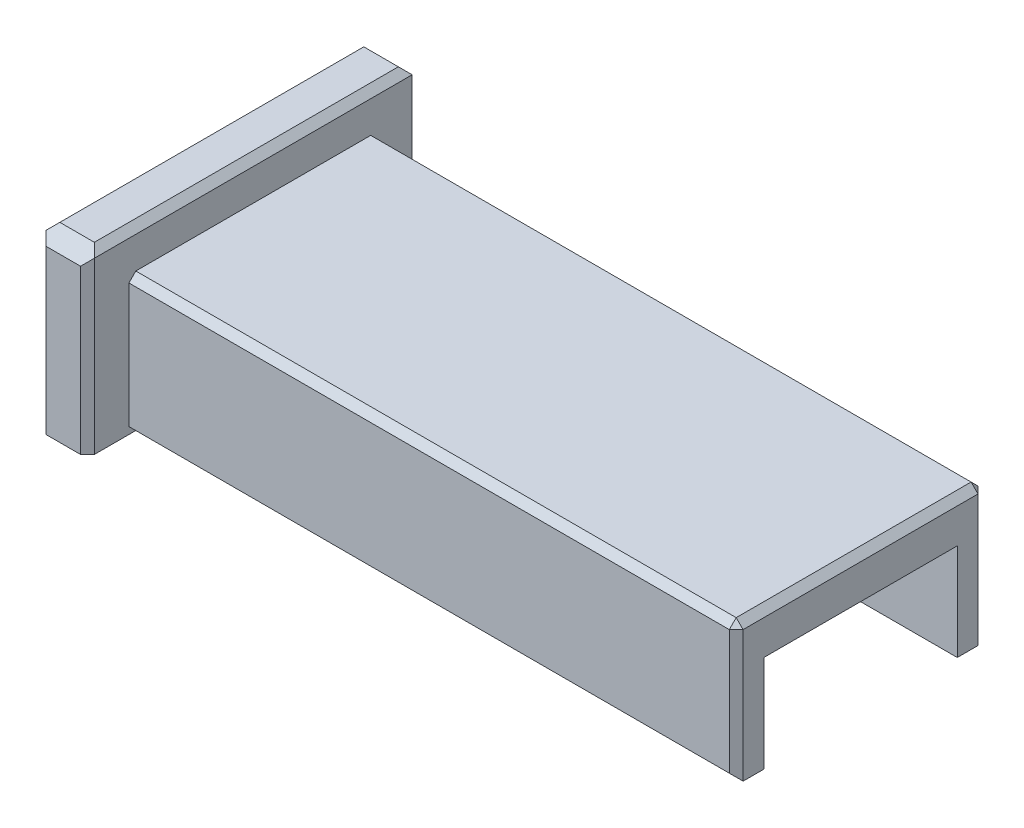
ISO-10303-21;
HEADER;
FILE_DESCRIPTION(('STEP AP214'),'2;1');
FILE_NAME('part.step','',(''),(''),'','','');
FILE_SCHEMA(('AUTOMOTIVE_DESIGN { 1 0 10303 214 1 1 1 1 }'));
ENDSEC;
DATA;
#1=APPLICATION_CONTEXT('core data for automotive mechanical design processes');
#2=APPLICATION_PROTOCOL_DEFINITION('international standard','automotive_design',2000,#1);
#3=PRODUCT_CONTEXT('',#1,'mechanical');
#4=PRODUCT('Part','Part','',(#3));
#5=PRODUCT_RELATED_PRODUCT_CATEGORY('part','',(#4));
#6=PRODUCT_DEFINITION_FORMATION('','',#4);
#7=PRODUCT_DEFINITION_CONTEXT('part definition',#1,'design');
#8=PRODUCT_DEFINITION('design','',#6,#7);
#9=PRODUCT_DEFINITION_SHAPE('','',#8);
#10=(LENGTH_UNIT() NAMED_UNIT(*) SI_UNIT(.MILLI.,.METRE.));
#11=(NAMED_UNIT(*) PLANE_ANGLE_UNIT() SI_UNIT($,.RADIAN.));
#12=(NAMED_UNIT(*) SI_UNIT($,.STERADIAN.) SOLID_ANGLE_UNIT());
#13=UNCERTAINTY_MEASURE_WITH_UNIT(LENGTH_MEASURE(1.E-05),#10,'distance_accuracy_value','');
#14=(GEOMETRIC_REPRESENTATION_CONTEXT(3) GLOBAL_UNCERTAINTY_ASSIGNED_CONTEXT((#13)) GLOBAL_UNIT_ASSIGNED_CONTEXT((#10,
#11,#12)) REPRESENTATION_CONTEXT('',''));
#15=CARTESIAN_POINT('',(0.,0.,0.));
#16=DIRECTION('',(0.,0.,1.));
#17=DIRECTION('',(1.,0.,0.));
#18=AXIS2_PLACEMENT_3D('',#15,#16,#17);
#19=CARTESIAN_POINT('',(0.,0.,0.));
#20=DIRECTION('',(0.,-1.,0.));
#21=DIRECTION('',(0.,0.,-1.));
#22=AXIS2_PLACEMENT_3D('',#19,#20,#21);
#23=PLANE('',#22);
#24=DIRECTION('',(0.,0.,1.));
#25=VECTOR('',#24,1.);
#26=CARTESIAN_POINT('',(-20.225,0.,-12.));
#27=LINE('',#26,#25);
#28=CARTESIAN_POINT('',(-20.225,0.,-11.5));
#29=VERTEX_POINT('',#28);
#30=CARTESIAN_POINT('',(-20.225,0.,-8.49999999999999));
#31=VERTEX_POINT('',#30);
#32=EDGE_CURVE('E408',#29,#31,#27,.T.);
#33=ORIENTED_EDGE('',*,*,#32,.T.);
#34=DIRECTION('',(1.,0.,0.));
#35=VECTOR('',#34,1.);
#36=CARTESIAN_POINT('',(23.725,0.,-8.49999999999999));
#37=LINE('',#36,#35);
#38=CARTESIAN_POINT('',(23.725,0.,-8.5));
#39=VERTEX_POINT('',#38);
#40=EDGE_CURVE('E230',#31,#39,#37,.T.);
#41=ORIENTED_EDGE('',*,*,#40,.T.);
#42=DIRECTION('',(0.,0.,-1.));
#43=VECTOR('',#42,1.);
#44=CARTESIAN_POINT('',(23.725,0.,9.));
#45=LINE('',#44,#43);
#46=CARTESIAN_POINT('',(23.725,0.,-7.));
#47=VERTEX_POINT('',#46);
#48=EDGE_CURVE('E223',#47,#39,#45,.T.);
#49=ORIENTED_EDGE('',*,*,#48,.F.);
#50=DIRECTION('',(-1.,0.,0.));
#51=VECTOR('',#50,1.);
#52=CARTESIAN_POINT('',(39.3774758424985,0.,-7.));
#53=LINE('',#52,#51);
#54=CARTESIAN_POINT('',(-23.225,0.,-7.));
#55=VERTEX_POINT('',#54);
#56=EDGE_CURVE('E207',#47,#55,#53,.T.);
#57=ORIENTED_EDGE('',*,*,#56,.T.);
#58=DIRECTION('',(0.70710678118654,0.,0.707106781186556));
#59=VECTOR('',#58,1.);
#60=CARTESIAN_POINT('',(-8.11250000000027,0.,8.11250000000009));
#61=LINE('',#60,#59);
#62=CARTESIAN_POINT('',(-23.725,0.,-7.5));
#63=VERTEX_POINT('',#62);
#64=EDGE_CURVE('E277',#55,#63,#61,.F.);
#65=ORIENTED_EDGE('',*,*,#64,.T.);
#66=DIRECTION('',(0.,0.,1.));
#67=VECTOR('',#66,1.);
#68=CARTESIAN_POINT('',(-23.725,0.,9.));
#69=LINE('',#68,#67);
#70=CARTESIAN_POINT('',(-23.725,0.,-11.5));
#71=VERTEX_POINT('',#70);
#72=EDGE_CURVE('E240',#71,#63,#69,.T.);
#73=ORIENTED_EDGE('',*,*,#72,.F.);
#74=DIRECTION('',(0.707106781186554,0.,-0.707106781186541));
#75=VECTOR('',#74,1.);
#76=CARTESIAN_POINT('',(-17.6124999999998,0.,-17.6125000000001));
#77=LINE('',#76,#75);
#78=CARTESIAN_POINT('',(-23.225,0.,-12.));
#79=VERTEX_POINT('',#78);
#80=EDGE_CURVE('E279',#71,#79,#77,.T.);
#81=ORIENTED_EDGE('',*,*,#80,.T.);
#82=DIRECTION('',(-1.,0.,0.));
#83=VECTOR('',#82,1.);
#84=CARTESIAN_POINT('',(-20.225,0.,-12.));
#85=LINE('',#84,#83);
#86=CARTESIAN_POINT('',(-20.725,0.,-12.));
#87=VERTEX_POINT('',#86);
#88=EDGE_CURVE('E402',#87,#79,#85,.T.);
#89=ORIENTED_EDGE('',*,*,#88,.F.);
#90=DIRECTION('',(-0.707106781186538,0.,-0.707106781186557));
#91=VECTOR('',#90,1.);
#92=CARTESIAN_POINT('',(-4.36250000000029,0.,4.36250000000017));
#93=LINE('',#92,#91);
#94=EDGE_CURVE('E281',#87,#29,#93,.F.);
#95=ORIENTED_EDGE('',*,*,#94,.T.);
#96=EDGE_LOOP('',(#33,#41,#49,#57,#65,#73,#81,#89,#95));
#97=FACE_BOUND('',#96,.T.);
#98=ADVANCED_FACE('F36',(#97),#23,.T.);
#99=CARTESIAN_POINT('',(23.725,10.,9.));
#100=DIRECTION('',(-1.,0.,0.));
#101=DIRECTION('',(0.,0.,1.));
#102=AXIS2_PLACEMENT_3D('',#99,#100,#101);
#103=PLANE('',#102);
#104=ORIENTED_EDGE('',*,*,#48,.T.);
#105=DIRECTION('',(0.,1.,0.));
#106=VECTOR('',#105,1.);
#107=CARTESIAN_POINT('',(23.725,10.,-8.5));
#108=LINE('',#107,#106);
#109=CARTESIAN_POINT('',(23.725,9.50000000000001,-8.5));
#110=VERTEX_POINT('',#109);
#111=EDGE_CURVE('E294',#39,#110,#108,.T.);
#112=ORIENTED_EDGE('',*,*,#111,.T.);
#113=DIRECTION('',(0.,0.,1.));
#114=VECTOR('',#113,1.);
#115=CARTESIAN_POINT('',(23.725,9.50000000000001,9.));
#116=LINE('',#115,#114);
#117=CARTESIAN_POINT('',(23.725,9.50000000000001,8.50000000000001));
#118=VERTEX_POINT('',#117);
#119=EDGE_CURVE('E292',#110,#118,#116,.T.);
#120=ORIENTED_EDGE('',*,*,#119,.T.);
#121=DIRECTION('',(0.,-1.,0.));
#122=VECTOR('',#121,1.);
#123=CARTESIAN_POINT('',(23.725,10.,8.50000000000001));
#124=LINE('',#123,#122);
#125=CARTESIAN_POINT('',(23.725,0.,8.50000000000001));
#126=VERTEX_POINT('',#125);
#127=EDGE_CURVE('E290',#118,#126,#124,.T.);
#128=ORIENTED_EDGE('',*,*,#127,.T.);
#129=CARTESIAN_POINT('',(23.725,0.,7.));
#130=VERTEX_POINT('',#129);
#131=EDGE_CURVE('E231',#126,#130,#45,.T.);
#132=ORIENTED_EDGE('',*,*,#131,.T.);
#133=DIRECTION('',(0.,-1.,0.));
#134=VECTOR('',#133,1.);
#135=CARTESIAN_POINT('',(23.725,0.,7.));
#136=LINE('',#135,#134);
#137=CARTESIAN_POINT('',(23.725,7.,7.));
#138=VERTEX_POINT('',#137);
#139=EDGE_CURVE('E517',#138,#130,#136,.T.);
#140=ORIENTED_EDGE('',*,*,#139,.F.);
#141=DIRECTION('',(0.,0.,1.));
#142=VECTOR('',#141,1.);
#143=CARTESIAN_POINT('',(23.725,7.,-7.));
#144=LINE('',#143,#142);
#145=CARTESIAN_POINT('',(23.725,7.,-7.));
#146=VERTEX_POINT('',#145);
#147=EDGE_CURVE('E226',#146,#138,#144,.T.);
#148=ORIENTED_EDGE('',*,*,#147,.F.);
#149=DIRECTION('',(0.,1.,0.));
#150=VECTOR('',#149,1.);
#151=CARTESIAN_POINT('',(23.725,0.,-7.));
#152=LINE('',#151,#150);
#153=EDGE_CURVE('E210',#47,#146,#152,.T.);
#154=ORIENTED_EDGE('',*,*,#153,.F.);
#155=EDGE_LOOP('',(#104,#112,#120,#128,#132,#140,#148,#154));
#156=FACE_BOUND('',#155,.T.);
#157=ADVANCED_FACE('F222',(#156),#103,.F.);
#158=CARTESIAN_POINT('',(-23.725,10.,-9.));
#159=DIRECTION('',(0.,0.,1.));
#160=DIRECTION('',(1.,0.,0.));
#161=AXIS2_PLACEMENT_3D('',#158,#159,#160);
#162=PLANE('',#161);
#163=DIRECTION('',(0.,-1.,0.));
#164=VECTOR('',#163,1.);
#165=CARTESIAN_POINT('',(23.225,10.,-9.));
#166=LINE('',#165,#164);
#167=CARTESIAN_POINT('',(23.225,9.5,-9.));
#168=VERTEX_POINT('',#167);
#169=CARTESIAN_POINT('',(23.225,0.499999999999994,-9.));
#170=VERTEX_POINT('',#169);
#171=EDGE_CURVE('E271',#168,#170,#166,.T.);
#172=ORIENTED_EDGE('',*,*,#171,.T.);
#173=DIRECTION('',(-1.,0.,0.));
#174=VECTOR('',#173,1.);
#175=CARTESIAN_POINT('',(-20.225,0.499999999999994,-9.));
#176=LINE('',#175,#174);
#177=CARTESIAN_POINT('',(-20.225,0.499999999999994,-9.));
#178=VERTEX_POINT('',#177);
#179=EDGE_CURVE('E275',#170,#178,#176,.T.);
#180=ORIENTED_EDGE('',*,*,#179,.T.);
#181=DIRECTION('',(0.,1.,0.));
#182=VECTOR('',#181,1.);
#183=CARTESIAN_POINT('',(-20.225,10.,-9.));
#184=LINE('',#183,#182);
#185=CARTESIAN_POINT('',(-20.225,9.5,-9.));
#186=VERTEX_POINT('',#185);
#187=EDGE_CURVE('E232',#178,#186,#184,.T.);
#188=ORIENTED_EDGE('',*,*,#187,.T.);
#189=DIRECTION('',(1.,0.,0.));
#190=VECTOR('',#189,1.);
#191=CARTESIAN_POINT('',(-23.725,9.5,-9.));
#192=LINE('',#191,#190);
#193=EDGE_CURVE('E273',#186,#168,#192,.T.);
#194=ORIENTED_EDGE('',*,*,#193,.T.);
#195=EDGE_LOOP('',(#172,#180,#188,#194));
#196=FACE_BOUND('',#195,.T.);
#197=ADVANCED_FACE('F464',(#196),#162,.F.);
#198=CARTESIAN_POINT('',(-23.725,10.,9.));
#199=DIRECTION('',(1.,0.,0.));
#200=DIRECTION('',(0.,0.,-1.));
#201=AXIS2_PLACEMENT_3D('',#198,#199,#200);
#202=PLANE('',#201);
#203=DIRECTION('',(0.,0.,-1.));
#204=VECTOR('',#203,1.);
#205=CARTESIAN_POINT('',(-23.725,12.3,-11.));
#206=LINE('',#205,#204);
#207=CARTESIAN_POINT('',(-23.725,12.3,11.5));
#208=VERTEX_POINT('',#207);
#209=CARTESIAN_POINT('',(-23.725,12.3,-11.5));
#210=VERTEX_POINT('',#209);
#211=EDGE_CURVE('E346',#208,#210,#206,.T.);
#212=ORIENTED_EDGE('',*,*,#211,.T.);
#213=DIRECTION('',(0.,-1.,0.));
#214=VECTOR('',#213,1.);
#215=CARTESIAN_POINT('',(-23.725,0.,-11.5));
#216=LINE('',#215,#214);
#217=EDGE_CURVE('E349',#210,#71,#216,.T.);
#218=ORIENTED_EDGE('',*,*,#217,.T.);
#219=ORIENTED_EDGE('',*,*,#72,.T.);
#220=DIRECTION('',(0.,1.,0.));
#221=VECTOR('',#220,1.);
#222=CARTESIAN_POINT('',(-23.725,10.,-7.5));
#223=LINE('',#222,#221);
#224=CARTESIAN_POINT('',(-23.725,7.5,-7.5));
#225=VERTEX_POINT('',#224);
#226=EDGE_CURVE('E337',#63,#225,#223,.T.);
#227=ORIENTED_EDGE('',*,*,#226,.T.);
#228=DIRECTION('',(0.,0.,1.));
#229=VECTOR('',#228,1.);
#230=CARTESIAN_POINT('',(-23.725,7.5,9.));
#231=LINE('',#230,#229);
#232=CARTESIAN_POINT('',(-23.725,7.5,7.5));
#233=VERTEX_POINT('',#232);
#234=EDGE_CURVE('E339',#225,#233,#231,.T.);
#235=ORIENTED_EDGE('',*,*,#234,.T.);
#236=DIRECTION('',(0.,-1.,0.));
#237=VECTOR('',#236,1.);
#238=CARTESIAN_POINT('',(-23.725,10.,7.5));
#239=LINE('',#238,#237);
#240=CARTESIAN_POINT('',(-23.725,0.,7.5));
#241=VERTEX_POINT('',#240);
#242=EDGE_CURVE('E341',#233,#241,#239,.T.);
#243=ORIENTED_EDGE('',*,*,#242,.T.);
#244=CARTESIAN_POINT('',(-23.725,0.,11.5));
#245=VERTEX_POINT('',#244);
#246=EDGE_CURVE('E234',#241,#245,#69,.T.);
#247=ORIENTED_EDGE('',*,*,#246,.T.);
#248=DIRECTION('',(0.,1.,0.));
#249=VECTOR('',#248,1.);
#250=CARTESIAN_POINT('',(-23.725,11.8,11.5));
#251=LINE('',#250,#249);
#252=EDGE_CURVE('E343',#245,#208,#251,.T.);
#253=ORIENTED_EDGE('',*,*,#252,.T.);
#254=EDGE_LOOP('',(#212,#218,#219,#227,#235,#243,#247,#253));
#255=FACE_BOUND('',#254,.T.);
#256=ADVANCED_FACE('F393',(#255),#202,.F.);
#257=CARTESIAN_POINT('',(-23.725,10.,9.));
#258=DIRECTION('',(0.,0.,-1.));
#259=DIRECTION('',(-1.,0.,0.));
#260=AXIS2_PLACEMENT_3D('',#257,#258,#259);
#261=PLANE('',#260);
#262=DIRECTION('',(0.,-1.,0.));
#263=VECTOR('',#262,1.);
#264=CARTESIAN_POINT('',(-20.225,10.,9.));
#265=LINE('',#264,#263);
#266=CARTESIAN_POINT('',(-20.225,9.5,9.));
#267=VERTEX_POINT('',#266);
#268=CARTESIAN_POINT('',(-20.225,0.5,9.));
#269=VERTEX_POINT('',#268);
#270=EDGE_CURVE('E236',#267,#269,#265,.T.);
#271=ORIENTED_EDGE('',*,*,#270,.T.);
#272=DIRECTION('',(1.,0.,0.));
#273=VECTOR('',#272,1.);
#274=CARTESIAN_POINT('',(23.725,0.5,9.));
#275=LINE('',#274,#273);
#276=CARTESIAN_POINT('',(23.225,0.5,9.));
#277=VERTEX_POINT('',#276);
#278=EDGE_CURVE('E259',#269,#277,#275,.T.);
#279=ORIENTED_EDGE('',*,*,#278,.T.);
#280=DIRECTION('',(0.,1.,0.));
#281=VECTOR('',#280,1.);
#282=CARTESIAN_POINT('',(23.225,10.,9.));
#283=LINE('',#282,#281);
#284=CARTESIAN_POINT('',(23.225,9.5,9.));
#285=VERTEX_POINT('',#284);
#286=EDGE_CURVE('E255',#277,#285,#283,.T.);
#287=ORIENTED_EDGE('',*,*,#286,.T.);
#288=DIRECTION('',(-1.,0.,0.));
#289=VECTOR('',#288,1.);
#290=CARTESIAN_POINT('',(-23.725,9.5,9.));
#291=LINE('',#290,#289);
#292=EDGE_CURVE('E257',#285,#267,#291,.T.);
#293=ORIENTED_EDGE('',*,*,#292,.T.);
#294=EDGE_LOOP('',(#271,#279,#287,#293));
#295=FACE_BOUND('',#294,.T.);
#296=ADVANCED_FACE('F420',(#295),#261,.F.);
#297=CARTESIAN_POINT('',(0.,10.,0.));
#298=DIRECTION('',(0.,-1.,0.));
#299=DIRECTION('',(0.,0.,-1.));
#300=AXIS2_PLACEMENT_3D('',#297,#298,#299);
#301=PLANE('',#300);
#302=DIRECTION('',(0.,0.,-1.));
#303=VECTOR('',#302,1.);
#304=CARTESIAN_POINT('',(23.225,10.,0.));
#305=LINE('',#304,#303);
#306=CARTESIAN_POINT('',(23.225,10.,8.50000000000001));
#307=VERTEX_POINT('',#306);
#308=CARTESIAN_POINT('',(23.225,10.,-8.5));
#309=VERTEX_POINT('',#308);
#310=EDGE_CURVE('E284',#307,#309,#305,.T.);
#311=ORIENTED_EDGE('',*,*,#310,.T.);
#312=DIRECTION('',(-1.,0.,0.));
#313=VECTOR('',#312,1.);
#314=CARTESIAN_POINT('',(0.,10.,-8.5));
#315=LINE('',#314,#313);
#316=CARTESIAN_POINT('',(-20.225,10.,-8.5));
#317=VERTEX_POINT('',#316);
#318=EDGE_CURVE('E288',#309,#317,#315,.T.);
#319=ORIENTED_EDGE('',*,*,#318,.T.);
#320=DIRECTION('',(0.,0.,1.));
#321=VECTOR('',#320,1.);
#322=CARTESIAN_POINT('',(-20.225,10.,0.));
#323=LINE('',#322,#321);
#324=CARTESIAN_POINT('',(-20.225,10.,8.50000000000001));
#325=VERTEX_POINT('',#324);
#326=EDGE_CURVE('E411',#317,#325,#323,.T.);
#327=ORIENTED_EDGE('',*,*,#326,.T.);
#328=DIRECTION('',(1.,0.,0.));
#329=VECTOR('',#328,1.);
#330=CARTESIAN_POINT('',(0.,10.,8.50000000000001));
#331=LINE('',#330,#329);
#332=EDGE_CURVE('E286',#325,#307,#331,.T.);
#333=ORIENTED_EDGE('',*,*,#332,.T.);
#334=EDGE_LOOP('',(#311,#319,#327,#333));
#335=FACE_BOUND('',#334,.T.);
#336=ADVANCED_FACE('F448',(#335),#301,.F.);
#337=ORIENTED_EDGE('',*,*,#131,.F.);
#338=DIRECTION('',(-1.,0.,0.));
#339=VECTOR('',#338,1.);
#340=CARTESIAN_POINT('',(-20.225,0.,8.50000000000001));
#341=LINE('',#340,#339);
#342=CARTESIAN_POINT('',(-20.225,0.,8.50000000000001));
#343=VERTEX_POINT('',#342);
#344=EDGE_CURVE('E268',#126,#343,#341,.T.);
#345=ORIENTED_EDGE('',*,*,#344,.T.);
#346=CARTESIAN_POINT('',(-20.225,0.,11.5));
#347=VERTEX_POINT('',#346);
#348=EDGE_CURVE('E227',#343,#347,#27,.T.);
#349=ORIENTED_EDGE('',*,*,#348,.T.);
#350=DIRECTION('',(0.707106781186538,0.,-0.707106781186557));
#351=VECTOR('',#350,1.);
#352=CARTESIAN_POINT('',(-4.36250000000029,0.,-4.36250000000017));
#353=LINE('',#352,#351);
#354=CARTESIAN_POINT('',(-20.725,0.,12.));
#355=VERTEX_POINT('',#354);
#356=EDGE_CURVE('E266',#347,#355,#353,.F.);
#357=ORIENTED_EDGE('',*,*,#356,.T.);
#358=DIRECTION('',(-1.,0.,0.));
#359=VECTOR('',#358,1.);
#360=CARTESIAN_POINT('',(-20.225,0.,12.));
#361=LINE('',#360,#359);
#362=CARTESIAN_POINT('',(-23.225,0.,12.));
#363=VERTEX_POINT('',#362);
#364=EDGE_CURVE('E407',#355,#363,#361,.T.);
#365=ORIENTED_EDGE('',*,*,#364,.T.);
#366=DIRECTION('',(-0.707106781186552,0.,-0.707106781186543));
#367=VECTOR('',#366,1.);
#368=CARTESIAN_POINT('',(-17.6124999999998,0.,17.6125000000001));
#369=LINE('',#368,#367);
#370=EDGE_CURVE('E264',#363,#245,#369,.T.);
#371=ORIENTED_EDGE('',*,*,#370,.T.);
#372=ORIENTED_EDGE('',*,*,#246,.F.);
#373=DIRECTION('',(-0.70710678118654,0.,0.707106781186555));
#374=VECTOR('',#373,1.);
#375=CARTESIAN_POINT('',(-8.11250000000025,0.,-8.11250000000008));
#376=LINE('',#375,#374);
#377=CARTESIAN_POINT('',(-23.225,0.,7.));
#378=VERTEX_POINT('',#377);
#379=EDGE_CURVE('E262',#241,#378,#376,.F.);
#380=ORIENTED_EDGE('',*,*,#379,.T.);
#381=DIRECTION('',(-1.,0.,0.));
#382=VECTOR('',#381,1.);
#383=CARTESIAN_POINT('',(39.3774758424985,0.,7.));
#384=LINE('',#383,#382);
#385=EDGE_CURVE('E216',#130,#378,#384,.T.);
#386=ORIENTED_EDGE('',*,*,#385,.F.);
#387=EDGE_LOOP('',(#337,#345,#349,#357,#365,#371,#372,#380,#386));
#388=FACE_BOUND('',#387,.T.);
#389=ADVANCED_FACE('F487',(#388),#23,.T.);
#390=CARTESIAN_POINT('',(-20.225,0.,0.));
#391=DIRECTION('',(1.,0.,0.));
#392=DIRECTION('',(0.,0.,-1.));
#393=AXIS2_PLACEMENT_3D('',#390,#391,#392);
#394=PLANE('',#393);
#395=ORIENTED_EDGE('',*,*,#32,.F.);
#396=DIRECTION('',(0.,1.,0.));
#397=VECTOR('',#396,1.);
#398=CARTESIAN_POINT('',(-20.225,0.,-11.5));
#399=LINE('',#398,#397);
#400=CARTESIAN_POINT('',(-20.225,12.3,-11.5));
#401=VERTEX_POINT('',#400);
#402=EDGE_CURVE('E306',#29,#401,#399,.T.);
#403=ORIENTED_EDGE('',*,*,#402,.T.);
#404=DIRECTION('',(0.,0.,1.));
#405=VECTOR('',#404,1.);
#406=CARTESIAN_POINT('',(-20.225,12.3,0.));
#407=LINE('',#406,#405);
#408=CARTESIAN_POINT('',(-20.225,12.3,11.5));
#409=VERTEX_POINT('',#408);
#410=EDGE_CURVE('E303',#401,#409,#407,.T.);
#411=ORIENTED_EDGE('',*,*,#410,.T.);
#412=DIRECTION('',(0.,-1.,0.));
#413=VECTOR('',#412,1.);
#414=CARTESIAN_POINT('',(-20.225,0.,11.5));
#415=LINE('',#414,#413);
#416=EDGE_CURVE('E301',#409,#347,#415,.T.);
#417=ORIENTED_EDGE('',*,*,#416,.T.);
#418=ORIENTED_EDGE('',*,*,#348,.F.);
#419=DIRECTION('',(0.,0.707106781186552,0.707106781186543));
#420=VECTOR('',#419,1.);
#421=CARTESIAN_POINT('',(-20.225,0.5,9.));
#422=LINE('',#421,#420);
#423=EDGE_CURVE('E357',#343,#269,#422,.T.);
#424=ORIENTED_EDGE('',*,*,#423,.T.);
#425=ORIENTED_EDGE('',*,*,#270,.F.);
#426=DIRECTION('',(0.,-0.707106781186552,0.707106781186543));
#427=VECTOR('',#426,1.);
#428=CARTESIAN_POINT('',(-20.225,10.,8.50000000000001));
#429=LINE('',#428,#427);
#430=EDGE_CURVE('E11',#267,#325,#429,.F.);
#431=ORIENTED_EDGE('',*,*,#430,.T.);
#432=ORIENTED_EDGE('',*,*,#326,.F.);
#433=DIRECTION('',(0.,0.707106781186552,0.707106781186543));
#434=VECTOR('',#433,1.);
#435=CARTESIAN_POINT('',(-20.225,10.,-8.5));
#436=LINE('',#435,#434);
#437=EDGE_CURVE('E46',#317,#186,#436,.F.);
#438=ORIENTED_EDGE('',*,*,#437,.T.);
#439=ORIENTED_EDGE('',*,*,#187,.F.);
#440=DIRECTION('',(0.,-0.707106781186543,0.707106781186552));
#441=VECTOR('',#440,1.);
#442=CARTESIAN_POINT('',(-20.225,0.499999999999994,-9.));
#443=LINE('',#442,#441);
#444=EDGE_CURVE('E359',#178,#31,#443,.T.);
#445=ORIENTED_EDGE('',*,*,#444,.T.);
#446=EDGE_LOOP('',(#395,#403,#411,#417,#418,#424,#425,#431,#432,#438,#439,#445));
#447=FACE_BOUND('',#446,.T.);
#448=ADVANCED_FACE('F470',(#447),#394,.T.);
#449=CARTESIAN_POINT('',(-20.225,0.,-12.));
#450=DIRECTION('',(0.,0.,-1.));
#451=DIRECTION('',(-1.,0.,0.));
#452=AXIS2_PLACEMENT_3D('',#449,#450,#451);
#453=PLANE('',#452);
#454=DIRECTION('',(1.,0.,0.));
#455=VECTOR('',#454,1.);
#456=CARTESIAN_POINT('',(-20.225,11.8,-12.));
#457=LINE('',#456,#455);
#458=CARTESIAN_POINT('',(-23.225,11.8,-12.));
#459=VERTEX_POINT('',#458);
#460=CARTESIAN_POINT('',(-20.725,11.8,-12.));
#461=VERTEX_POINT('',#460);
#462=EDGE_CURVE('E249',#459,#461,#457,.T.);
#463=ORIENTED_EDGE('',*,*,#462,.T.);
#464=DIRECTION('',(0.,-1.,0.));
#465=VECTOR('',#464,1.);
#466=CARTESIAN_POINT('',(-20.725,0.,-12.));
#467=LINE('',#466,#465);
#468=EDGE_CURVE('E298',#461,#87,#467,.T.);
#469=ORIENTED_EDGE('',*,*,#468,.T.);
#470=ORIENTED_EDGE('',*,*,#88,.T.);
#471=DIRECTION('',(0.,1.,0.));
#472=VECTOR('',#471,1.);
#473=CARTESIAN_POINT('',(-23.225,11.8,-12.));
#474=LINE('',#473,#472);
#475=EDGE_CURVE('E296',#79,#459,#474,.T.);
#476=ORIENTED_EDGE('',*,*,#475,.T.);
#477=EDGE_LOOP('',(#463,#469,#470,#476));
#478=FACE_BOUND('',#477,.T.);
#479=ADVANCED_FACE('F404',(#478),#453,.T.);
#480=CARTESIAN_POINT('',(-20.225,12.8,-12.));
#481=DIRECTION('',(0.,1.,0.));
#482=DIRECTION('',(0.,0.,1.));
#483=AXIS2_PLACEMENT_3D('',#480,#481,#482);
#484=PLANE('',#483);
#485=DIRECTION('',(1.,0.,0.));
#486=VECTOR('',#485,1.);
#487=CARTESIAN_POINT('',(-20.225,12.8,11.));
#488=LINE('',#487,#486);
#489=CARTESIAN_POINT('',(-23.225,12.8,11.));
#490=VERTEX_POINT('',#489);
#491=CARTESIAN_POINT('',(-20.725,12.8,11.));
#492=VERTEX_POINT('',#491);
#493=EDGE_CURVE('E243',#490,#492,#488,.T.);
#494=ORIENTED_EDGE('',*,*,#493,.T.);
#495=DIRECTION('',(0.,0.,-1.));
#496=VECTOR('',#495,1.);
#497=CARTESIAN_POINT('',(-20.725,12.8,-12.));
#498=LINE('',#497,#496);
#499=CARTESIAN_POINT('',(-20.725,12.8,-11.));
#500=VERTEX_POINT('',#499);
#501=EDGE_CURVE('E320',#492,#500,#498,.T.);
#502=ORIENTED_EDGE('',*,*,#501,.T.);
#503=DIRECTION('',(-1.,0.,0.));
#504=VECTOR('',#503,1.);
#505=CARTESIAN_POINT('',(-20.225,12.8,-11.));
#506=LINE('',#505,#504);
#507=CARTESIAN_POINT('',(-23.225,12.8,-11.));
#508=VERTEX_POINT('',#507);
#509=EDGE_CURVE('E246',#500,#508,#506,.T.);
#510=ORIENTED_EDGE('',*,*,#509,.T.);
#511=DIRECTION('',(0.,0.,1.));
#512=VECTOR('',#511,1.);
#513=CARTESIAN_POINT('',(-23.225,12.8,11.));
#514=LINE('',#513,#512);
#515=EDGE_CURVE('E318',#508,#490,#514,.T.);
#516=ORIENTED_EDGE('',*,*,#515,.T.);
#517=EDGE_LOOP('',(#494,#502,#510,#516));
#518=FACE_BOUND('',#517,.T.);
#519=ADVANCED_FACE('F551',(#518),#484,.T.);
#520=CARTESIAN_POINT('',(-20.225,0.,12.));
#521=DIRECTION('',(0.,0.,1.));
#522=DIRECTION('',(1.,0.,0.));
#523=AXIS2_PLACEMENT_3D('',#520,#521,#522);
#524=PLANE('',#523);
#525=ORIENTED_EDGE('',*,*,#364,.F.);
#526=DIRECTION('',(0.,1.,0.));
#527=VECTOR('',#526,1.);
#528=CARTESIAN_POINT('',(-20.725,0.,12.));
#529=LINE('',#528,#527);
#530=CARTESIAN_POINT('',(-20.725,11.8,12.));
#531=VERTEX_POINT('',#530);
#532=EDGE_CURVE('E334',#355,#531,#529,.T.);
#533=ORIENTED_EDGE('',*,*,#532,.T.);
#534=DIRECTION('',(-1.,0.,0.));
#535=VECTOR('',#534,1.);
#536=CARTESIAN_POINT('',(-20.225,11.8,12.));
#537=LINE('',#536,#535);
#538=CARTESIAN_POINT('',(-23.225,11.8,12.));
#539=VERTEX_POINT('',#538);
#540=EDGE_CURVE('E252',#531,#539,#537,.T.);
#541=ORIENTED_EDGE('',*,*,#540,.T.);
#542=DIRECTION('',(0.,-1.,0.));
#543=VECTOR('',#542,1.);
#544=CARTESIAN_POINT('',(-23.225,0.,12.));
#545=LINE('',#544,#543);
#546=EDGE_CURVE('E332',#539,#363,#545,.T.);
#547=ORIENTED_EDGE('',*,*,#546,.T.);
#548=EDGE_LOOP('',(#525,#533,#541,#547));
#549=FACE_BOUND('',#548,.T.);
#550=ADVANCED_FACE('F493',(#549),#524,.T.);
#551=CARTESIAN_POINT('',(39.3774758424985,0.,-7.));
#552=DIRECTION('',(0.,0.,-1.));
#553=DIRECTION('',(-1.,0.,0.));
#554=AXIS2_PLACEMENT_3D('',#551,#552,#553);
#555=PLANE('',#554);
#556=DIRECTION('',(-1.,0.,0.));
#557=VECTOR('',#556,1.);
#558=CARTESIAN_POINT('',(39.3774758424985,7.,-7.));
#559=LINE('',#558,#557);
#560=CARTESIAN_POINT('',(-23.225,7.,-7.));
#561=VERTEX_POINT('',#560);
#562=EDGE_CURVE('E515',#146,#561,#559,.T.);
#563=ORIENTED_EDGE('',*,*,#562,.T.);
#564=DIRECTION('',(0.,-1.,0.));
#565=VECTOR('',#564,1.);
#566=CARTESIAN_POINT('',(-23.225,0.,-7.));
#567=LINE('',#566,#565);
#568=EDGE_CURVE('E212',#561,#55,#567,.T.);
#569=ORIENTED_EDGE('',*,*,#568,.T.);
#570=ORIENTED_EDGE('',*,*,#56,.F.);
#571=ORIENTED_EDGE('',*,*,#153,.T.);
#572=EDGE_LOOP('',(#563,#569,#570,#571));
#573=FACE_BOUND('',#572,.T.);
#574=ADVANCED_FACE('F209',(#573),#555,.F.);
#575=CARTESIAN_POINT('',(39.3774758424985,7.,-7.));
#576=DIRECTION('',(0.,1.,0.));
#577=DIRECTION('',(0.,0.,1.));
#578=AXIS2_PLACEMENT_3D('',#575,#576,#577);
#579=PLANE('',#578);
#580=DIRECTION('',(-1.,0.,0.));
#581=VECTOR('',#580,1.);
#582=CARTESIAN_POINT('',(39.3774758424985,7.,7.));
#583=LINE('',#582,#581);
#584=CARTESIAN_POINT('',(-23.225,7.,7.));
#585=VERTEX_POINT('',#584);
#586=EDGE_CURVE('E513',#138,#585,#583,.T.);
#587=ORIENTED_EDGE('',*,*,#586,.T.);
#588=DIRECTION('',(0.,0.,-1.));
#589=VECTOR('',#588,1.);
#590=CARTESIAN_POINT('',(-23.225,7.,-7.));
#591=LINE('',#590,#589);
#592=EDGE_CURVE('E54',#585,#561,#591,.T.);
#593=ORIENTED_EDGE('',*,*,#592,.T.);
#594=ORIENTED_EDGE('',*,*,#562,.F.);
#595=ORIENTED_EDGE('',*,*,#147,.T.);
#596=EDGE_LOOP('',(#587,#593,#594,#595));
#597=FACE_BOUND('',#596,.T.);
#598=ADVANCED_FACE('F514',(#597),#579,.F.);
#599=CARTESIAN_POINT('',(39.3774758424985,0.,7.));
#600=DIRECTION('',(0.,0.,1.));
#601=DIRECTION('',(1.,0.,0.));
#602=AXIS2_PLACEMENT_3D('',#599,#600,#601);
#603=PLANE('',#602);
#604=ORIENTED_EDGE('',*,*,#385,.T.);
#605=DIRECTION('',(0.,1.,0.));
#606=VECTOR('',#605,1.);
#607=CARTESIAN_POINT('',(-23.225,0.,7.));
#608=LINE('',#607,#606);
#609=EDGE_CURVE('E352',#378,#585,#608,.T.);
#610=ORIENTED_EDGE('',*,*,#609,.T.);
#611=ORIENTED_EDGE('',*,*,#586,.F.);
#612=ORIENTED_EDGE('',*,*,#139,.T.);
#613=EDGE_LOOP('',(#604,#610,#611,#612));
#614=FACE_BOUND('',#613,.T.);
#615=ADVANCED_FACE('F511',(#614),#603,.F.);
#616=CARTESIAN_POINT('',(-20.225,12.8,-11.));
#617=DIRECTION('',(0.,-0.707106781186547,0.707106781186547));
#618=DIRECTION('',(-1.,0.,0.));
#619=AXIS2_PLACEMENT_3D('',#616,#617,#618);
#620=PLANE('',#619);
#621=DIRECTION('',(0.577350269189615,-0.577350269189631,-0.577350269189631));
#622=VECTOR('',#621,1.);
#623=CARTESIAN_POINT('',(-20.5583333333333,12.6333333333333,-11.1666666666667));
#624=LINE('',#623,#622);
#625=EDGE_CURVE('E314',#500,#401,#624,.T.);
#626=ORIENTED_EDGE('',*,*,#625,.T.);
#627=DIRECTION('',(-0.577350269189615,-0.577350269189631,-0.577350269189631));
#628=VECTOR('',#627,1.);
#629=CARTESIAN_POINT('',(-19.8916666666667,12.6333333333333,-11.1666666666667));
#630=LINE('',#629,#628);
#631=EDGE_CURVE('E316',#401,#461,#630,.T.);
#632=ORIENTED_EDGE('',*,*,#631,.T.);
#633=ORIENTED_EDGE('',*,*,#462,.F.);
#634=DIRECTION('',(0.577350269189633,-0.577350269189622,-0.577350269189622));
#635=VECTOR('',#634,1.);
#636=CARTESIAN_POINT('',(-22.8916666666667,11.4666666666667,-12.3333333333333));
#637=LINE('',#636,#635);
#638=EDGE_CURVE('E309',#459,#210,#637,.F.);
#639=ORIENTED_EDGE('',*,*,#638,.T.);
#640=DIRECTION('',(-0.577350269189631,-0.577350269189623,-0.577350269189623));
#641=VECTOR('',#640,1.);
#642=CARTESIAN_POINT('',(-22.225,13.8,-9.99999999999999));
#643=LINE('',#642,#641);
#644=EDGE_CURVE('E312',#210,#508,#643,.F.);
#645=ORIENTED_EDGE('',*,*,#644,.T.);
#646=ORIENTED_EDGE('',*,*,#509,.F.);
#647=EDGE_LOOP('',(#626,#632,#633,#639,#645,#646));
#648=FACE_BOUND('',#647,.T.);
#649=ADVANCED_FACE('F528',(#648),#620,.F.);
#650=CARTESIAN_POINT('',(-20.225,11.8,12.));
#651=DIRECTION('',(0.,-0.707106781186547,-0.707106781186547));
#652=DIRECTION('',(-1.,0.,0.));
#653=AXIS2_PLACEMENT_3D('',#650,#651,#652);
#654=PLANE('',#653);
#655=DIRECTION('',(0.577350269189615,0.577350269189631,-0.577350269189631));
#656=VECTOR('',#655,1.);
#657=CARTESIAN_POINT('',(-20.5583333333333,11.9666666666667,11.8333333333333));
#658=LINE('',#657,#656);
#659=EDGE_CURVE('E328',#531,#409,#658,.T.);
#660=ORIENTED_EDGE('',*,*,#659,.T.);
#661=DIRECTION('',(-0.577350269189615,0.577350269189631,-0.577350269189631));
#662=VECTOR('',#661,1.);
#663=CARTESIAN_POINT('',(-19.8916666666667,11.9666666666667,11.8333333333333));
#664=LINE('',#663,#662);
#665=EDGE_CURVE('E330',#409,#492,#664,.T.);
#666=ORIENTED_EDGE('',*,*,#665,.T.);
#667=ORIENTED_EDGE('',*,*,#493,.F.);
#668=DIRECTION('',(0.577350269189631,0.577350269189623,-0.577350269189623));
#669=VECTOR('',#668,1.);
#670=CARTESIAN_POINT('',(-22.8916666666667,13.1333333333333,10.6666666666667));
#671=LINE('',#670,#669);
#672=EDGE_CURVE('E325',#490,#208,#671,.F.);
#673=ORIENTED_EDGE('',*,*,#672,.T.);
#674=DIRECTION('',(-0.577350269189631,0.577350269189623,-0.577350269189623));
#675=VECTOR('',#674,1.);
#676=CARTESIAN_POINT('',(-22.225,10.8,13.));
#677=LINE('',#676,#675);
#678=EDGE_CURVE('E323',#208,#539,#677,.F.);
#679=ORIENTED_EDGE('',*,*,#678,.T.);
#680=ORIENTED_EDGE('',*,*,#540,.F.);
#681=EDGE_LOOP('',(#660,#666,#667,#673,#679,#680));
#682=FACE_BOUND('',#681,.T.);
#683=ADVANCED_FACE('F496',(#682),#654,.F.);
#684=CARTESIAN_POINT('',(-23.725,0.499999999999994,-9.));
#685=DIRECTION('',(0.,-0.707106781186552,-0.707106781186543));
#686=DIRECTION('',(1.,0.,0.));
#687=AXIS2_PLACEMENT_3D('',#684,#685,#686);
#688=PLANE('',#687);
#689=ORIENTED_EDGE('',*,*,#444,.F.);
#690=ORIENTED_EDGE('',*,*,#179,.F.);
#691=DIRECTION('',(0.577350269189634,-0.577350269189618,0.577350269189626));
#692=VECTOR('',#691,1.);
#693=CARTESIAN_POINT('',(20.0583333333333,3.66666666666658,-12.1666666666666));
#694=LINE('',#693,#692);
#695=EDGE_CURVE('E217',#39,#170,#694,.F.);
#696=ORIENTED_EDGE('',*,*,#695,.F.);
#697=ORIENTED_EDGE('',*,*,#40,.F.);
#698=EDGE_LOOP('',(#689,#690,#696,#697));
#699=FACE_BOUND('',#698,.T.);
#700=ADVANCED_FACE('F468',(#699),#688,.T.);
#701=CARTESIAN_POINT('',(0.,10.,-8.5));
#702=DIRECTION('',(0.,-0.707106781186543,0.707106781186552));
#703=DIRECTION('',(-1.,0.,0.));
#704=AXIS2_PLACEMENT_3D('',#701,#702,#703);
#705=PLANE('',#704);
#706=ORIENTED_EDGE('',*,*,#437,.F.);
#707=ORIENTED_EDGE('',*,*,#318,.F.);
#708=DIRECTION('',(0.,-0.707106781186552,-0.707106781186543));
#709=VECTOR('',#708,1.);
#710=CARTESIAN_POINT('',(23.225,9.5,-9.));
#711=LINE('',#710,#709);
#712=EDGE_CURVE('E380',#168,#309,#711,.F.);
#713=ORIENTED_EDGE('',*,*,#712,.F.);
#714=ORIENTED_EDGE('',*,*,#193,.F.);
#715=EDGE_LOOP('',(#706,#707,#713,#714));
#716=FACE_BOUND('',#715,.T.);
#717=ADVANCED_FACE('F453',(#716),#705,.F.);
#718=CARTESIAN_POINT('',(23.225,10.,-9.));
#719=DIRECTION('',(-0.707106781186543,0.,0.707106781186552));
#720=DIRECTION('',(0.,-1.,0.));
#721=AXIS2_PLACEMENT_3D('',#718,#719,#720);
#722=PLANE('',#721);
#723=ORIENTED_EDGE('',*,*,#695,.T.);
#724=ORIENTED_EDGE('',*,*,#171,.F.);
#725=DIRECTION('',(0.707106781186552,0.,0.707106781186543));
#726=VECTOR('',#725,1.);
#727=CARTESIAN_POINT('',(23.225,9.5,-9.));
#728=LINE('',#727,#726);
#729=EDGE_CURVE('E377',#110,#168,#728,.F.);
#730=ORIENTED_EDGE('',*,*,#729,.F.);
#731=ORIENTED_EDGE('',*,*,#111,.F.);
#732=EDGE_LOOP('',(#723,#724,#730,#731));
#733=FACE_BOUND('',#732,.T.);
#734=ADVANCED_FACE('F461',(#733),#722,.F.);
#735=CARTESIAN_POINT('',(23.225,9.5,-9.));
#736=DIRECTION('',(0.577350269189618,0.577350269189626,-0.577350269189634));
#737=DIRECTION('',(0.,0.707106781186552,0.707106781186543));
#738=AXIS2_PLACEMENT_3D('',#735,#736,#737);
#739=PLANE('',#738);
#740=ORIENTED_EDGE('',*,*,#729,.T.);
#741=ORIENTED_EDGE('',*,*,#712,.T.);
#742=DIRECTION('',(-0.707106781186552,0.707106781186543,0.));
#743=VECTOR('',#742,1.);
#744=CARTESIAN_POINT('',(23.475,9.75,-8.5));
#745=LINE('',#744,#743);
#746=EDGE_CURVE('E374',#110,#309,#745,.T.);
#747=ORIENTED_EDGE('',*,*,#746,.F.);
#748=EDGE_LOOP('',(#740,#741,#747));
#749=FACE_BOUND('',#748,.T.);
#750=ADVANCED_FACE('F456',(#749),#739,.T.);
#751=CARTESIAN_POINT('',(0.,10.,8.50000000000001));
#752=DIRECTION('',(0.,-0.707106781186543,-0.707106781186552));
#753=DIRECTION('',(1.,0.,0.));
#754=AXIS2_PLACEMENT_3D('',#751,#752,#753);
#755=PLANE('',#754);
#756=ORIENTED_EDGE('',*,*,#430,.F.);
#757=ORIENTED_EDGE('',*,*,#292,.F.);
#758=DIRECTION('',(0.,0.707106781186552,-0.707106781186543));
#759=VECTOR('',#758,1.);
#760=CARTESIAN_POINT('',(23.225,10.,8.50000000000001));
#761=LINE('',#760,#759);
#762=EDGE_CURVE('E371',#307,#285,#761,.F.);
#763=ORIENTED_EDGE('',*,*,#762,.F.);
#764=ORIENTED_EDGE('',*,*,#332,.F.);
#765=EDGE_LOOP('',(#756,#757,#763,#764));
#766=FACE_BOUND('',#765,.T.);
#767=ADVANCED_FACE('F436',(#766),#755,.F.);
#768=CARTESIAN_POINT('',(23.225,10.,0.));
#769=DIRECTION('',(-0.707106781186543,-0.707106781186552,0.));
#770=DIRECTION('',(0.,0.,-1.));
#771=AXIS2_PLACEMENT_3D('',#768,#769,#770);
#772=PLANE('',#771);
#773=ORIENTED_EDGE('',*,*,#746,.T.);
#774=ORIENTED_EDGE('',*,*,#310,.F.);
#775=DIRECTION('',(0.707106781186552,-0.707106781186543,0.));
#776=VECTOR('',#775,1.);
#777=CARTESIAN_POINT('',(23.225,10.,8.50000000000001));
#778=LINE('',#777,#776);
#779=EDGE_CURVE('E368',#118,#307,#778,.F.);
#780=ORIENTED_EDGE('',*,*,#779,.F.);
#781=ORIENTED_EDGE('',*,*,#119,.F.);
#782=EDGE_LOOP('',(#773,#774,#780,#781));
#783=FACE_BOUND('',#782,.T.);
#784=ADVANCED_FACE('F444',(#783),#772,.F.);
#785=CARTESIAN_POINT('',(23.225,10.,8.50000000000001));
#786=DIRECTION('',(0.577350269189618,0.577350269189626,0.577350269189634));
#787=DIRECTION('',(0.,-0.707106781186552,0.707106781186543));
#788=AXIS2_PLACEMENT_3D('',#785,#786,#787);
#789=PLANE('',#788);
#790=ORIENTED_EDGE('',*,*,#779,.T.);
#791=ORIENTED_EDGE('',*,*,#762,.T.);
#792=DIRECTION('',(-0.707106781186552,0.,0.707106781186543));
#793=VECTOR('',#792,1.);
#794=CARTESIAN_POINT('',(23.475,9.5,8.75000000000001));
#795=LINE('',#794,#793);
#796=EDGE_CURVE('E365',#118,#285,#795,.T.);
#797=ORIENTED_EDGE('',*,*,#796,.F.);
#798=EDGE_LOOP('',(#790,#791,#797));
#799=FACE_BOUND('',#798,.T.);
#800=ADVANCED_FACE('F439',(#799),#789,.T.);
#801=CARTESIAN_POINT('',(23.725,10.,8.50000000000001));
#802=DIRECTION('',(-0.707106781186543,0.,-0.707106781186552));
#803=DIRECTION('',(0.,-1.,0.));
#804=AXIS2_PLACEMENT_3D('',#801,#802,#803);
#805=PLANE('',#804);
#806=ORIENTED_EDGE('',*,*,#796,.T.);
#807=ORIENTED_EDGE('',*,*,#286,.F.);
#808=DIRECTION('',(-0.577350269189628,0.577350269189628,0.57735026918962));
#809=VECTOR('',#808,1.);
#810=CARTESIAN_POINT('',(20.3916666666666,3.33333333333336,11.8333333333333));
#811=LINE('',#810,#809);
#812=EDGE_CURVE('E363',#126,#277,#811,.T.);
#813=ORIENTED_EDGE('',*,*,#812,.F.);
#814=ORIENTED_EDGE('',*,*,#127,.F.);
#815=EDGE_LOOP('',(#806,#807,#813,#814));
#816=FACE_BOUND('',#815,.T.);
#817=ADVANCED_FACE('F432',(#816),#805,.F.);
#818=CARTESIAN_POINT('',(-23.725,0.5,9.));
#819=DIRECTION('',(0.,-0.707106781186543,0.707106781186552));
#820=DIRECTION('',(-1.,0.,0.));
#821=AXIS2_PLACEMENT_3D('',#818,#819,#820);
#822=PLANE('',#821);
#823=ORIENTED_EDGE('',*,*,#423,.F.);
#824=ORIENTED_EDGE('',*,*,#344,.F.);
#825=ORIENTED_EDGE('',*,*,#812,.T.);
#826=ORIENTED_EDGE('',*,*,#278,.F.);
#827=EDGE_LOOP('',(#823,#824,#825,#826));
#828=FACE_BOUND('',#827,.T.);
#829=ADVANCED_FACE('F426',(#828),#822,.T.);
#830=CARTESIAN_POINT('',(-20.725,0.,-12.));
#831=DIRECTION('',(-0.707106781186557,0.,0.707106781186538));
#832=DIRECTION('',(0.,-1.,0.));
#833=AXIS2_PLACEMENT_3D('',#830,#831,#832);
#834=PLANE('',#833);
#835=ORIENTED_EDGE('',*,*,#631,.F.);
#836=ORIENTED_EDGE('',*,*,#402,.F.);
#837=ORIENTED_EDGE('',*,*,#94,.F.);
#838=ORIENTED_EDGE('',*,*,#468,.F.);
#839=EDGE_LOOP('',(#835,#836,#837,#838));
#840=FACE_BOUND('',#839,.T.);
#841=ADVANCED_FACE('F474',(#840),#834,.F.);
#842=CARTESIAN_POINT('',(-20.725,12.8,-12.));
#843=DIRECTION('',(-0.707106781186557,-0.707106781186538,0.));
#844=DIRECTION('',(0.,0.,-1.));
#845=AXIS2_PLACEMENT_3D('',#842,#843,#844);
#846=PLANE('',#845);
#847=ORIENTED_EDGE('',*,*,#665,.F.);
#848=ORIENTED_EDGE('',*,*,#410,.F.);
#849=ORIENTED_EDGE('',*,*,#625,.F.);
#850=ORIENTED_EDGE('',*,*,#501,.F.);
#851=EDGE_LOOP('',(#847,#848,#849,#850));
#852=FACE_BOUND('',#851,.T.);
#853=ADVANCED_FACE('F479',(#852),#846,.F.);
#854=CARTESIAN_POINT('',(-20.725,0.,12.));
#855=DIRECTION('',(-0.707106781186557,0.,-0.707106781186538));
#856=DIRECTION('',(0.,1.,0.));
#857=AXIS2_PLACEMENT_3D('',#854,#855,#856);
#858=PLANE('',#857);
#859=ORIENTED_EDGE('',*,*,#356,.F.);
#860=ORIENTED_EDGE('',*,*,#416,.F.);
#861=ORIENTED_EDGE('',*,*,#659,.F.);
#862=ORIENTED_EDGE('',*,*,#532,.F.);
#863=EDGE_LOOP('',(#859,#860,#861,#862));
#864=FACE_BOUND('',#863,.T.);
#865=ADVANCED_FACE('F490',(#864),#858,.F.);
#866=CARTESIAN_POINT('',(-23.725,12.3,9.));
#867=DIRECTION('',(-0.707106781186543,0.707106781186552,0.));
#868=DIRECTION('',(0.,0.,1.));
#869=AXIS2_PLACEMENT_3D('',#866,#867,#868);
#870=PLANE('',#869);
#871=ORIENTED_EDGE('',*,*,#672,.F.);
#872=ORIENTED_EDGE('',*,*,#515,.F.);
#873=ORIENTED_EDGE('',*,*,#644,.F.);
#874=ORIENTED_EDGE('',*,*,#211,.F.);
#875=EDGE_LOOP('',(#871,#872,#873,#874));
#876=FACE_BOUND('',#875,.T.);
#877=ADVANCED_FACE('F561',(#876),#870,.T.);
#878=CARTESIAN_POINT('',(-23.725,10.,-11.5));
#879=DIRECTION('',(-0.707106781186541,0.,-0.707106781186554));
#880=DIRECTION('',(0.,1.,0.));
#881=AXIS2_PLACEMENT_3D('',#878,#879,#880);
#882=PLANE('',#881);
#883=ORIENTED_EDGE('',*,*,#638,.F.);
#884=ORIENTED_EDGE('',*,*,#475,.F.);
#885=ORIENTED_EDGE('',*,*,#80,.F.);
#886=ORIENTED_EDGE('',*,*,#217,.F.);
#887=EDGE_LOOP('',(#883,#884,#885,#886));
#888=FACE_BOUND('',#887,.T.);
#889=ADVANCED_FACE('F398',(#888),#882,.T.);
#890=CARTESIAN_POINT('',(-23.725,10.,11.5));
#891=DIRECTION('',(-0.707106781186542,0.,0.707106781186552));
#892=DIRECTION('',(0.,-1.,0.));
#893=AXIS2_PLACEMENT_3D('',#890,#891,#892);
#894=PLANE('',#893);
#895=ORIENTED_EDGE('',*,*,#370,.F.);
#896=ORIENTED_EDGE('',*,*,#546,.F.);
#897=ORIENTED_EDGE('',*,*,#678,.F.);
#898=ORIENTED_EDGE('',*,*,#252,.F.);
#899=EDGE_LOOP('',(#895,#896,#897,#898));
#900=FACE_BOUND('',#899,.T.);
#901=ADVANCED_FACE('F502',(#900),#894,.T.);
#902=CARTESIAN_POINT('',(-23.225,0.,-7.));
#903=DIRECTION('',(0.707106781186555,0.,-0.707106781186539));
#904=DIRECTION('',(0.,-1.,0.));
#905=AXIS2_PLACEMENT_3D('',#902,#903,#904);
#906=PLANE('',#905);
#907=ORIENTED_EDGE('',*,*,#64,.F.);
#908=ORIENTED_EDGE('',*,*,#568,.F.);
#909=DIRECTION('',(-0.577350269189617,0.577350269189629,-0.57735026918963));
#910=VECTOR('',#909,1.);
#911=CARTESIAN_POINT('',(-23.225,7.,-7.));
#912=LINE('',#911,#910);
#913=EDGE_CURVE('E41',#225,#561,#912,.F.);
#914=ORIENTED_EDGE('',*,*,#913,.F.);
#915=ORIENTED_EDGE('',*,*,#226,.F.);
#916=EDGE_LOOP('',(#907,#908,#914,#915));
#917=FACE_BOUND('',#916,.T.);
#918=ADVANCED_FACE('F39',(#917),#906,.F.);
#919=CARTESIAN_POINT('',(-23.225,7.,-7.));
#920=DIRECTION('',(0.707106781186555,0.70710678118654,0.));
#921=DIRECTION('',(0.,0.,-1.));
#922=AXIS2_PLACEMENT_3D('',#919,#920,#921);
#923=PLANE('',#922);
#924=ORIENTED_EDGE('',*,*,#913,.T.);
#925=ORIENTED_EDGE('',*,*,#592,.F.);
#926=DIRECTION('',(-0.577350269189618,0.57735026918963,0.57735026918963));
#927=VECTOR('',#926,1.);
#928=CARTESIAN_POINT('',(-20.8916666666667,4.66666666666663,4.66666666666663));
#929=LINE('',#928,#927);
#930=EDGE_CURVE('E62',#233,#585,#929,.F.);
#931=ORIENTED_EDGE('',*,*,#930,.F.);
#932=ORIENTED_EDGE('',*,*,#234,.F.);
#933=EDGE_LOOP('',(#924,#925,#931,#932));
#934=FACE_BOUND('',#933,.T.);
#935=ADVANCED_FACE('F388',(#934),#923,.F.);
#936=CARTESIAN_POINT('',(-23.225,0.,7.));
#937=DIRECTION('',(0.707106781186555,0.,0.70710678118654));
#938=DIRECTION('',(0.,1.,0.));
#939=AXIS2_PLACEMENT_3D('',#936,#937,#938);
#940=PLANE('',#939);
#941=ORIENTED_EDGE('',*,*,#379,.F.);
#942=ORIENTED_EDGE('',*,*,#242,.F.);
#943=ORIENTED_EDGE('',*,*,#930,.T.);
#944=ORIENTED_EDGE('',*,*,#609,.F.);
#945=EDGE_LOOP('',(#941,#942,#943,#944));
#946=FACE_BOUND('',#945,.T.);
#947=ADVANCED_FACE('F508',(#946),#940,.F.);
#948=CLOSED_SHELL('',(#98,#157,#197,#256,#296,#336,#389,#448,#479,#519,#550,#574,#598,#615,#649,
#683,#700,#717,#734,#750,#767,#784,#800,#817,#829,#841,#853,#865,#877,#889,#901,#918,#935,#947));
#949=MANIFOLD_SOLID_BREP('B2',#948);
#950=ADVANCED_BREP_SHAPE_REPRESENTATION('',(#18,#949),#14);
#951=SHAPE_DEFINITION_REPRESENTATION(#9,#950);
ENDSEC;
END-ISO-10303-21;
